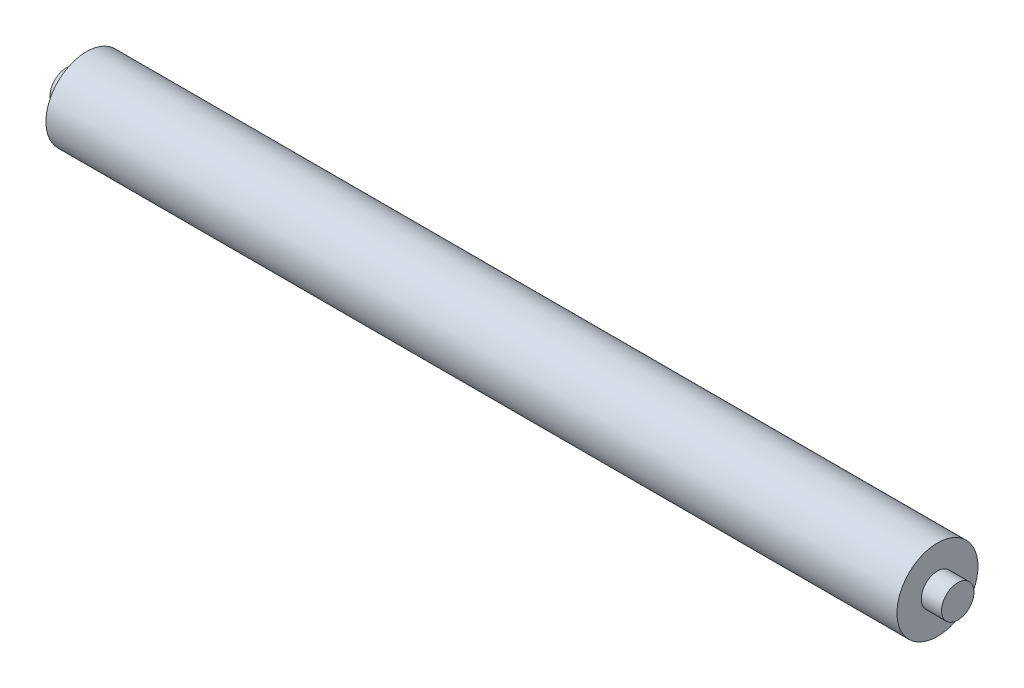
ISO-10303-21;
HEADER;
FILE_DESCRIPTION(('STEP AP214'),'2;1');
FILE_NAME('part.step','',(''),(''),'','','');
FILE_SCHEMA(('AUTOMOTIVE_DESIGN { 1 0 10303 214 1 1 1 1 }'));
ENDSEC;
DATA;
#1=APPLICATION_CONTEXT('core data for automotive mechanical design processes');
#2=APPLICATION_PROTOCOL_DEFINITION('international standard','automotive_design',2000,#1);
#3=PRODUCT_CONTEXT('',#1,'mechanical');
#4=PRODUCT('Part','Part','',(#3));
#5=PRODUCT_RELATED_PRODUCT_CATEGORY('part','',(#4));
#6=PRODUCT_DEFINITION_FORMATION('','',#4);
#7=PRODUCT_DEFINITION_CONTEXT('part definition',#1,'design');
#8=PRODUCT_DEFINITION('design','',#6,#7);
#9=PRODUCT_DEFINITION_SHAPE('','',#8);
#10=(LENGTH_UNIT() NAMED_UNIT(*) SI_UNIT(.MILLI.,.METRE.));
#11=(NAMED_UNIT(*) PLANE_ANGLE_UNIT() SI_UNIT($,.RADIAN.));
#12=(NAMED_UNIT(*) SI_UNIT($,.STERADIAN.) SOLID_ANGLE_UNIT());
#13=UNCERTAINTY_MEASURE_WITH_UNIT(LENGTH_MEASURE(1.E-05),#10,'distance_accuracy_value','');
#14=(GEOMETRIC_REPRESENTATION_CONTEXT(3) GLOBAL_UNCERTAINTY_ASSIGNED_CONTEXT((#13)) GLOBAL_UNIT_ASSIGNED_CONTEXT((#10,
#11,#12)) REPRESENTATION_CONTEXT('',''));
#15=CARTESIAN_POINT('',(0.,0.,0.));
#16=DIRECTION('',(0.,0.,1.));
#17=DIRECTION('',(1.,0.,0.));
#18=AXIS2_PLACEMENT_3D('',#15,#16,#17);
#19=CARTESIAN_POINT('',(52.5,0.,0.));
#20=DIRECTION('',(-1.,0.,0.));
#21=DIRECTION('',(0.,0.,1.));
#22=AXIS2_PLACEMENT_3D('',#19,#20,#21);
#23=CYLINDRICAL_SURFACE('',#22,5.);
#24=CARTESIAN_POINT('',(52.5,0.,0.));
#25=DIRECTION('',(1.,0.,0.));
#26=DIRECTION('',(0.,0.,-1.));
#27=AXIS2_PLACEMENT_3D('',#24,#25,#26);
#28=CIRCLE('',#27,5.);
#29=CARTESIAN_POINT('',(52.5,0.,-5.));
#30=VERTEX_POINT('',#29);
#31=EDGE_CURVE('E37',#30,#30,#28,.T.);
#32=ORIENTED_EDGE('',*,*,#31,.F.);
#33=EDGE_LOOP('',(#32));
#34=FACE_BOUND('',#33,.T.);
#35=CARTESIAN_POINT('',(-52.5,0.,0.));
#36=DIRECTION('',(1.,0.,0.));
#37=DIRECTION('',(0.,0.,-1.));
#38=AXIS2_PLACEMENT_3D('',#35,#36,#37);
#39=CIRCLE('',#38,5.);
#40=CARTESIAN_POINT('',(-52.5,0.,-5.));
#41=VERTEX_POINT('',#40);
#42=EDGE_CURVE('E41',#41,#41,#39,.T.);
#43=ORIENTED_EDGE('',*,*,#42,.T.);
#44=EDGE_LOOP('',(#43));
#45=FACE_BOUND('',#44,.T.);
#46=ADVANCED_FACE('F31',(#34,#45),#23,.T.);
#47=CARTESIAN_POINT('',(52.5,0.,0.));
#48=DIRECTION('',(1.,0.,0.));
#49=DIRECTION('',(0.,0.,-1.));
#50=AXIS2_PLACEMENT_3D('',#47,#48,#49);
#51=PLANE('',#50);
#52=CARTESIAN_POINT('',(52.5,0.,0.));
#53=DIRECTION('',(1.,0.,0.));
#54=DIRECTION('',(0.,0.,-1.));
#55=AXIS2_PLACEMENT_3D('',#52,#53,#54);
#56=CIRCLE('',#55,2.);
#57=CARTESIAN_POINT('',(52.5,0.,-2.));
#58=VERTEX_POINT('',#57);
#59=EDGE_CURVE('E46',#58,#58,#56,.F.);
#60=ORIENTED_EDGE('',*,*,#59,.T.);
#61=EDGE_LOOP('',(#60));
#62=FACE_BOUND('',#61,.T.);
#63=ORIENTED_EDGE('',*,*,#31,.T.);
#64=EDGE_LOOP('',(#63));
#65=FACE_BOUND('',#64,.T.);
#66=ADVANCED_FACE('F75',(#62,#65),#51,.T.);
#67=CARTESIAN_POINT('',(-52.5,0.,0.));
#68=DIRECTION('',(1.,0.,0.));
#69=DIRECTION('',(0.,0.,-1.));
#70=AXIS2_PLACEMENT_3D('',#67,#68,#69);
#71=PLANE('',#70);
#72=CARTESIAN_POINT('',(-52.5,0.,0.));
#73=DIRECTION('',(1.,0.,0.));
#74=DIRECTION('',(0.,0.,-1.));
#75=AXIS2_PLACEMENT_3D('',#72,#73,#74);
#76=CIRCLE('',#75,2.);
#77=CARTESIAN_POINT('',(-52.5,0.,-2.));
#78=VERTEX_POINT('',#77);
#79=EDGE_CURVE('E10',#78,#78,#76,.F.);
#80=ORIENTED_EDGE('',*,*,#79,.F.);
#81=EDGE_LOOP('',(#80));
#82=FACE_BOUND('',#81,.T.);
#83=ORIENTED_EDGE('',*,*,#42,.F.);
#84=EDGE_LOOP('',(#83));
#85=FACE_BOUND('',#84,.T.);
#86=ADVANCED_FACE('F80',(#82,#85),#71,.F.);
#87=CARTESIAN_POINT('',(-55.,0.,0.));
#88=DIRECTION('',(1.,0.,0.));
#89=DIRECTION('',(0.,0.,-1.));
#90=AXIS2_PLACEMENT_3D('',#87,#88,#89);
#91=PLANE('',#90);
#92=CARTESIAN_POINT('',(-55.,0.,0.));
#93=DIRECTION('',(1.,0.,0.));
#94=DIRECTION('',(0.,0.,-1.));
#95=AXIS2_PLACEMENT_3D('',#92,#93,#94);
#96=CIRCLE('',#95,2.);
#97=CARTESIAN_POINT('',(-55.,0.,-2.));
#98=VERTEX_POINT('',#97);
#99=EDGE_CURVE('E51',#98,#98,#96,.T.);
#100=ORIENTED_EDGE('',*,*,#99,.F.);
#101=EDGE_LOOP('',(#100));
#102=FACE_BOUND('',#101,.T.);
#103=ADVANCED_FACE('F69',(#102),#91,.F.);
#104=CARTESIAN_POINT('',(55.,0.,0.));
#105=DIRECTION('',(-1.,0.,0.));
#106=DIRECTION('',(0.,0.,1.));
#107=AXIS2_PLACEMENT_3D('',#104,#105,#106);
#108=CYLINDRICAL_SURFACE('',#107,2.);
#109=ORIENTED_EDGE('',*,*,#99,.T.);
#110=EDGE_LOOP('',(#109));
#111=FACE_BOUND('',#110,.T.);
#112=ORIENTED_EDGE('',*,*,#79,.T.);
#113=EDGE_LOOP('',(#112));
#114=FACE_BOUND('',#113,.T.);
#115=ADVANCED_FACE('F61',(#111,#114),#108,.T.);
#116=ORIENTED_EDGE('',*,*,#59,.F.);
#117=EDGE_LOOP('',(#116));
#118=FACE_BOUND('',#117,.T.);
#119=CARTESIAN_POINT('',(55.,0.,0.));
#120=DIRECTION('',(1.,0.,0.));
#121=DIRECTION('',(0.,0.,-1.));
#122=AXIS2_PLACEMENT_3D('',#119,#120,#121);
#123=CIRCLE('',#122,2.);
#124=CARTESIAN_POINT('',(55.,0.,-2.));
#125=VERTEX_POINT('',#124);
#126=EDGE_CURVE('E50',#125,#125,#123,.T.);
#127=ORIENTED_EDGE('',*,*,#126,.F.);
#128=EDGE_LOOP('',(#127));
#129=FACE_BOUND('',#128,.T.);
#130=ADVANCED_FACE('F59',(#118,#129),#108,.T.);
#131=CARTESIAN_POINT('',(55.,0.,0.));
#132=DIRECTION('',(1.,0.,0.));
#133=DIRECTION('',(0.,0.,-1.));
#134=AXIS2_PLACEMENT_3D('',#131,#132,#133);
#135=PLANE('',#134);
#136=ORIENTED_EDGE('',*,*,#126,.T.);
#137=EDGE_LOOP('',(#136));
#138=FACE_BOUND('',#137,.T.);
#139=ADVANCED_FACE('F57',(#138),#135,.T.);
#140=CLOSED_SHELL('',(#46,#66,#86,#103,#115,#130,#139));
#141=MANIFOLD_SOLID_BREP('B2',#140);
#142=ADVANCED_BREP_SHAPE_REPRESENTATION('',(#18,#141),#14);
#143=SHAPE_DEFINITION_REPRESENTATION(#9,#142);
ENDSEC;
END-ISO-10303-21;
